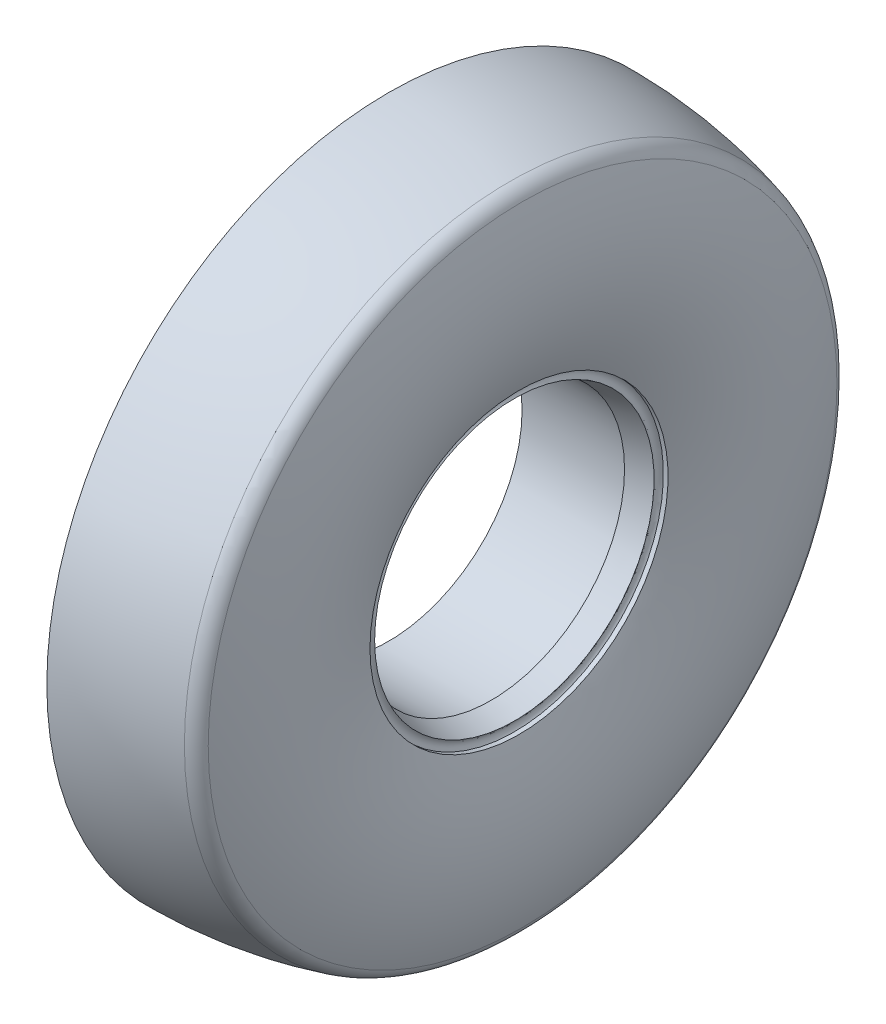
ISO-10303-21;
HEADER;
FILE_DESCRIPTION(('STEP AP214'),'2;1');
FILE_NAME('part.step','',(''),(''),'','','');
FILE_SCHEMA(('AUTOMOTIVE_DESIGN { 1 0 10303 214 1 1 1 1 }'));
ENDSEC;
DATA;
#1=APPLICATION_CONTEXT('core data for automotive mechanical design processes');
#2=APPLICATION_PROTOCOL_DEFINITION('international standard','automotive_design',2000,#1);
#3=PRODUCT_CONTEXT('',#1,'mechanical');
#4=PRODUCT('Part','Part','',(#3));
#5=PRODUCT_RELATED_PRODUCT_CATEGORY('part','',(#4));
#6=PRODUCT_DEFINITION_FORMATION('','',#4);
#7=PRODUCT_DEFINITION_CONTEXT('part definition',#1,'design');
#8=PRODUCT_DEFINITION('design','',#6,#7);
#9=PRODUCT_DEFINITION_SHAPE('','',#8);
#10=(LENGTH_UNIT() NAMED_UNIT(*) SI_UNIT(.MILLI.,.METRE.));
#11=(NAMED_UNIT(*) PLANE_ANGLE_UNIT() SI_UNIT($,.RADIAN.));
#12=(NAMED_UNIT(*) SI_UNIT($,.STERADIAN.) SOLID_ANGLE_UNIT());
#13=UNCERTAINTY_MEASURE_WITH_UNIT(LENGTH_MEASURE(1.E-05),#10,'distance_accuracy_value','');
#14=(GEOMETRIC_REPRESENTATION_CONTEXT(3) GLOBAL_UNCERTAINTY_ASSIGNED_CONTEXT((#13)) GLOBAL_UNIT_ASSIGNED_CONTEXT((#10,
#11,#12)) REPRESENTATION_CONTEXT('',''));
#15=CARTESIAN_POINT('',(0.,0.,0.));
#16=DIRECTION('',(0.,0.,1.));
#17=DIRECTION('',(1.,0.,0.));
#18=AXIS2_PLACEMENT_3D('',#15,#16,#17);
#19=CARTESIAN_POINT('',(6.74999999999973,0.,-8.));
#20=CARTESIAN_POINT('',(6.54999999999973,0.,-7.75));
#21=CARTESIAN_POINT('',(6.74999999999973,0.,-7.5));
#22=B_SPLINE_CURVE_WITH_KNOTS('',2,(#19,#20,#21),.UNSPECIFIED.,.F.,.F.,(3,3),(0.,1.),.UNSPECIFIED.);
#23=CARTESIAN_POINT('',(-281.405379576005,0.,0.));
#24=DIRECTION('',(-1.,0.,0.));
#25=AXIS1_PLACEMENT('',#23,#24);
#26=SURFACE_OF_REVOLUTION('',#22,#25);
#27=CARTESIAN_POINT('',(6.75000000000003,0.,0.));
#28=DIRECTION('',(-1.,0.,0.));
#29=DIRECTION('',(0.,0.,1.));
#30=AXIS2_PLACEMENT_3D('',#27,#28,#29);
#31=CIRCLE('',#30,7.5);
#32=CARTESIAN_POINT('',(6.75000000000003,0.,7.5));
#33=VERTEX_POINT('',#32);
#34=EDGE_CURVE('E71',#33,#33,#31,.T.);
#35=ORIENTED_EDGE('',*,*,#34,.T.);
#36=EDGE_LOOP('',(#35));
#37=FACE_BOUND('',#36,.T.);
#38=CARTESIAN_POINT('',(6.75000000000003,0.,0.));
#39=DIRECTION('',(-1.,0.,0.));
#40=DIRECTION('',(0.,0.,1.));
#41=AXIS2_PLACEMENT_3D('',#38,#39,#40);
#42=CIRCLE('',#41,8.);
#43=CARTESIAN_POINT('',(6.75000000000003,0.,8.));
#44=VERTEX_POINT('',#43);
#45=EDGE_CURVE('E53',#44,#44,#42,.T.);
#46=ORIENTED_EDGE('',*,*,#45,.F.);
#47=EDGE_LOOP('',(#46));
#48=FACE_BOUND('',#47,.T.);
#49=ADVANCED_FACE('F42',(#37,#48),#26,.F.);
#50=CARTESIAN_POINT('',(-281.405379576005,0.,0.));
#51=DIRECTION('',(-1.,0.,0.));
#52=DIRECTION('',(0.,0.,1.));
#53=AXIS2_PLACEMENT_3D('',#50,#51,#52);
#54=CYLINDRICAL_SURFACE('',#53,8.);
#55=ORIENTED_EDGE('',*,*,#45,.T.);
#56=EDGE_LOOP('',(#55));
#57=FACE_BOUND('',#56,.T.);
#58=CARTESIAN_POINT('',(7.00000000000006,0.,0.));
#59=DIRECTION('',(-1.,0.,0.));
#60=DIRECTION('',(0.,0.,1.));
#61=AXIS2_PLACEMENT_3D('',#58,#59,#60);
#62=CIRCLE('',#61,8.);
#63=CARTESIAN_POINT('',(7.00000000000006,0.,8.));
#64=VERTEX_POINT('',#63);
#65=EDGE_CURVE('E57',#64,#64,#62,.T.);
#66=ORIENTED_EDGE('',*,*,#65,.F.);
#67=EDGE_LOOP('',(#66));
#68=FACE_BOUND('',#67,.T.);
#69=ADVANCED_FACE('F90',(#57,#68),#54,.F.);
#70=CARTESIAN_POINT('',(6.9999999999997,0.,-17.344));
#71=CARTESIAN_POINT('',(9.00087304325459,0.,-12.6630499999051));
#72=CARTESIAN_POINT('',(6.99999999999973,0.,-8.));
#73=B_SPLINE_CURVE_WITH_KNOTS('',2,(#70,#71,#72),.UNSPECIFIED.,.F.,.F.,(3,3),(0.,1.),.UNSPECIFIED.);
#74=CARTESIAN_POINT('',(-281.405379576005,0.,0.));
#75=DIRECTION('',(-1.,0.,0.));
#76=AXIS1_PLACEMENT('',#74,#75);
#77=SURFACE_OF_REVOLUTION('',#73,#76);
#78=CARTESIAN_POINT('',(7.19136152203093,0.,0.));
#79=DIRECTION('',(-1.,0.,0.));
#80=DIRECTION('',(0.,0.,1.));
#81=AXIS2_PLACEMENT_3D('',#78,#79,#80);
#82=CIRCLE('',#81,16.8726255363413);
#83=CARTESIAN_POINT('',(7.19136152203093,0.,16.8726255363413));
#84=VERTEX_POINT('',#83);
#85=EDGE_CURVE('E10',#84,#84,#82,.F.);
#86=ORIENTED_EDGE('',*,*,#85,.T.);
#87=EDGE_LOOP('',(#86));
#88=FACE_BOUND('',#87,.T.);
#89=ORIENTED_EDGE('',*,*,#65,.T.);
#90=EDGE_LOOP('',(#89));
#91=FACE_BOUND('',#90,.T.);
#92=ADVANCED_FACE('F85',(#88,#91),#77,.F.);
#93=CARTESIAN_POINT('',(0.,0.,0.));
#94=DIRECTION('',(-1.,0.,0.));
#95=DIRECTION('',(0.,0.,1.));
#96=AXIS2_PLACEMENT_3D('',#93,#94,#95);
#97=DEGENERATE_TOROIDAL_SURFACE('',#96,6.6559999999998,24.9999999999998,.F.);
#98=CARTESIAN_POINT('',(6.51872105080622,0.,0.));
#99=DIRECTION('',(-1.,0.,0.));
#100=DIRECTION('',(0.,0.,1.));
#101=AXIS2_PLACEMENT_3D('',#98,#99,#100);
#102=CIRCLE('',#101,17.4791667875276);
#103=CARTESIAN_POINT('',(6.51872105080622,0.,17.4791667875276));
#104=VERTEX_POINT('',#103);
#105=EDGE_CURVE('E49',#104,#104,#102,.T.);
#106=ORIENTED_EDGE('',*,*,#105,.T.);
#107=EDGE_LOOP('',(#106));
#108=FACE_BOUND('',#107,.T.);
#109=CARTESIAN_POINT('',(0.,0.,0.));
#110=DIRECTION('',(-1.,0.,0.));
#111=DIRECTION('',(0.,0.,1.));
#112=AXIS2_PLACEMENT_3D('',#109,#110,#111);
#113=CIRCLE('',#112,18.344);
#114=CARTESIAN_POINT('',(0.,0.,18.344));
#115=VERTEX_POINT('',#114);
#116=EDGE_CURVE('E62',#115,#115,#113,.T.);
#117=ORIENTED_EDGE('',*,*,#116,.F.);
#118=EDGE_LOOP('',(#117));
#119=FACE_BOUND('',#118,.T.);
#120=ADVANCED_FACE('F89',(#108,#119),#97,.F.);
#121=CARTESIAN_POINT('',(0.,0.,0.));
#122=DIRECTION('',(1.,0.,0.));
#123=DIRECTION('',(0.,0.,-1.));
#124=AXIS2_PLACEMENT_3D('',#121,#122,#123);
#125=PLANE('',#124);
#126=CARTESIAN_POINT('',(0.,0.,0.));
#127=DIRECTION('',(-1.,0.,0.));
#128=DIRECTION('',(0.,0.,1.));
#129=AXIS2_PLACEMENT_3D('',#126,#127,#128);
#130=CIRCLE('',#129,7.1650635094611);
#131=CARTESIAN_POINT('',(0.,0.,7.1650635094611));
#132=VERTEX_POINT('',#131);
#133=EDGE_CURVE('E65',#132,#132,#130,.T.);
#134=ORIENTED_EDGE('',*,*,#133,.F.);
#135=EDGE_LOOP('',(#134));
#136=FACE_BOUND('',#135,.T.);
#137=ORIENTED_EDGE('',*,*,#116,.T.);
#138=EDGE_LOOP('',(#137));
#139=FACE_BOUND('',#138,.T.);
#140=ADVANCED_FACE('F115',(#136,#139),#125,.F.);
#141=CARTESIAN_POINT('',(-281.405379576005,0.,0.));
#142=DIRECTION('',(-1.,0.,0.));
#143=DIRECTION('',(0.,0.,1.));
#144=AXIS2_PLACEMENT_3D('',#141,#142,#143);
#145=CYLINDRICAL_SURFACE('',#144,7.1650635094611);
#146=ORIENTED_EDGE('',*,*,#133,.T.);
#147=EDGE_LOOP('',(#146));
#148=FACE_BOUND('',#147,.T.);
#149=CARTESIAN_POINT('',(5.50000000000006,0.,0.));
#150=DIRECTION('',(-1.,0.,0.));
#151=DIRECTION('',(0.,0.,1.));
#152=AXIS2_PLACEMENT_3D('',#149,#150,#151);
#153=CIRCLE('',#152,7.1650635094611);
#154=CARTESIAN_POINT('',(5.50000000000006,0.,7.1650635094611));
#155=VERTEX_POINT('',#154);
#156=EDGE_CURVE('E68',#155,#155,#153,.T.);
#157=ORIENTED_EDGE('',*,*,#156,.F.);
#158=EDGE_LOOP('',(#157));
#159=FACE_BOUND('',#158,.T.);
#160=ADVANCED_FACE('F107',(#148,#159),#145,.F.);
#161=CARTESIAN_POINT('',(6.75000000000003,0.,0.));
#162=DIRECTION('',(1.,0.,0.));
#163=DIRECTION('',(0.,0.,-1.));
#164=AXIS2_PLACEMENT_3D('',#161,#162,#163);
#165=CONICAL_SURFACE('',#164,7.5,0.261799387799149);
#166=ORIENTED_EDGE('',*,*,#156,.T.);
#167=EDGE_LOOP('',(#166));
#168=FACE_BOUND('',#167,.T.);
#169=ORIENTED_EDGE('',*,*,#34,.F.);
#170=EDGE_LOOP('',(#169));
#171=FACE_BOUND('',#170,.T.);
#172=ADVANCED_FACE('F105',(#168,#171),#165,.F.);
#173=CARTESIAN_POINT('',(6.25797220877397,0.,0.));
#174=DIRECTION('',(1.,0.,0.));
#175=DIRECTION('',(0.,0.,-1.));
#176=AXIS2_PLACEMENT_3D('',#173,#174,#175);
#177=TOROIDAL_SURFACE('',#176,16.5137601160265,1.);
#178=ORIENTED_EDGE('',*,*,#85,.F.);
#179=EDGE_LOOP('',(#178));
#180=FACE_BOUND('',#179,.T.);
#181=ORIENTED_EDGE('',*,*,#105,.F.);
#182=EDGE_LOOP('',(#181));
#183=FACE_BOUND('',#182,.T.);
#184=ADVANCED_FACE('F44',(#180,#183),#177,.T.);
#185=CLOSED_SHELL('',(#49,#69,#92,#120,#140,#160,#172,#184));
#186=MANIFOLD_SOLID_BREP('B2',#185);
#187=ADVANCED_BREP_SHAPE_REPRESENTATION('',(#18,#186),#14);
#188=SHAPE_DEFINITION_REPRESENTATION(#9,#187);
ENDSEC;
END-ISO-10303-21;
